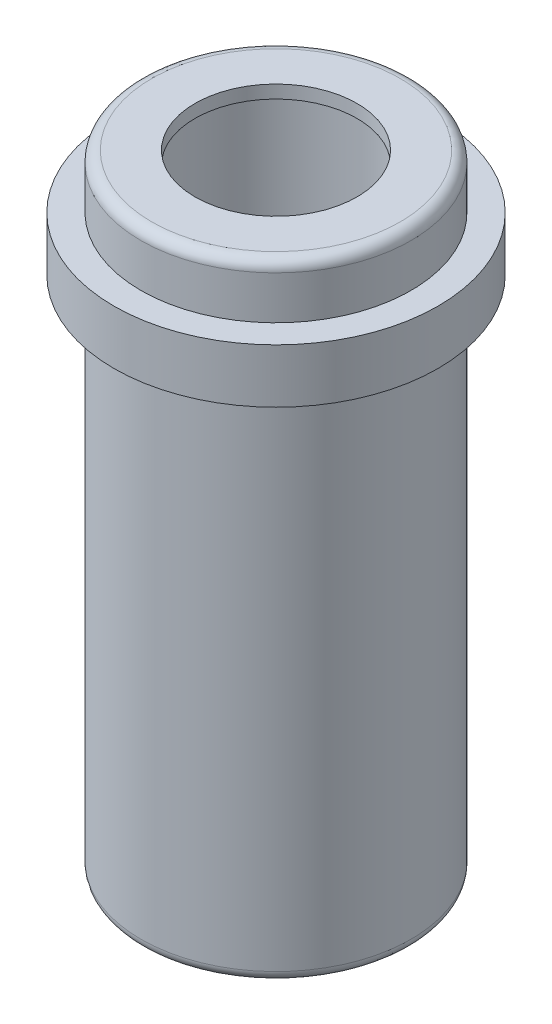
ISO-10303-21;
HEADER;
FILE_DESCRIPTION(('STEP AP214'),'2;1');
FILE_NAME('part.step','',(''),(''),'','','');
FILE_SCHEMA(('AUTOMOTIVE_DESIGN { 1 0 10303 214 1 1 1 1 }'));
ENDSEC;
DATA;
#1=APPLICATION_CONTEXT('core data for automotive mechanical design processes');
#2=APPLICATION_PROTOCOL_DEFINITION('international standard','automotive_design',2000,#1);
#3=PRODUCT_CONTEXT('',#1,'mechanical');
#4=PRODUCT('Part','Part','',(#3));
#5=PRODUCT_RELATED_PRODUCT_CATEGORY('part','',(#4));
#6=PRODUCT_DEFINITION_FORMATION('','',#4);
#7=PRODUCT_DEFINITION_CONTEXT('part definition',#1,'design');
#8=PRODUCT_DEFINITION('design','',#6,#7);
#9=PRODUCT_DEFINITION_SHAPE('','',#8);
#10=(LENGTH_UNIT() NAMED_UNIT(*) SI_UNIT(.MILLI.,.METRE.));
#11=(NAMED_UNIT(*) PLANE_ANGLE_UNIT() SI_UNIT($,.RADIAN.));
#12=(NAMED_UNIT(*) SI_UNIT($,.STERADIAN.) SOLID_ANGLE_UNIT());
#13=UNCERTAINTY_MEASURE_WITH_UNIT(LENGTH_MEASURE(1.E-05),#10,'distance_accuracy_value','');
#14=(GEOMETRIC_REPRESENTATION_CONTEXT(3) GLOBAL_UNCERTAINTY_ASSIGNED_CONTEXT((#13)) GLOBAL_UNIT_ASSIGNED_CONTEXT((#10,
#11,#12)) REPRESENTATION_CONTEXT('',''));
#15=CARTESIAN_POINT('',(0.,0.,0.));
#16=DIRECTION('',(0.,0.,1.));
#17=DIRECTION('',(1.,0.,0.));
#18=AXIS2_PLACEMENT_3D('',#15,#16,#17);
#19=CARTESIAN_POINT('',(0.,-4.20414276315988,0.));
#20=DIRECTION('',(0.,1.,0.));
#21=DIRECTION('',(0.,0.,1.));
#22=AXIS2_PLACEMENT_3D('',#19,#20,#21);
#23=CONICAL_SURFACE('',#22,0.,0.981268029555178);
#24=CARTESIAN_POINT('',(0.,-3.6,0.));
#25=DIRECTION('',(0.,1.,0.));
#26=DIRECTION('',(0.,0.,1.));
#27=AXIS2_PLACEMENT_3D('',#24,#25,#26);
#28=CIRCLE('',#27,0.903225337817097);
#29=CARTESIAN_POINT('',(0.,-3.6,0.903225337817097));
#30=VERTEX_POINT('',#29);
#31=EDGE_CURVE('E77',#30,#30,#28,.T.);
#32=ORIENTED_EDGE('',*,*,#31,.T.);
#33=EDGE_LOOP('',(#32));
#34=FACE_BOUND('',#33,.T.);
#35=CARTESIAN_POINT('',(0.,-4.20414276315988,0.));
#36=VERTEX_POINT('',#35);
#37=VERTEX_LOOP('',#36);
#38=FACE_BOUND('',#37,.T.);
#39=ADVANCED_FACE('F35',(#34,#38),#23,.F.);
#40=CARTESIAN_POINT('',(0.,8.23878905517164,0.));
#41=DIRECTION('',(0.,1.,0.));
#42=DIRECTION('',(0.,0.,1.));
#43=AXIS2_PLACEMENT_3D('',#40,#41,#42);
#44=CYLINDRICAL_SURFACE('',#43,0.903225337817098);
#45=CARTESIAN_POINT('',(0.,0.879741215099305,0.));
#46=DIRECTION('',(0.,1.,0.));
#47=DIRECTION('',(0.,0.,1.));
#48=AXIS2_PLACEMENT_3D('',#45,#46,#47);
#49=CIRCLE('',#48,0.903225337817098);
#50=CARTESIAN_POINT('',(0.,0.879741215099305,0.903225337817098));
#51=VERTEX_POINT('',#50);
#52=EDGE_CURVE('E80',#51,#51,#49,.T.);
#53=ORIENTED_EDGE('',*,*,#52,.T.);
#54=EDGE_LOOP('',(#53));
#55=FACE_BOUND('',#54,.T.);
#56=ORIENTED_EDGE('',*,*,#31,.F.);
#57=EDGE_LOOP('',(#56));
#58=FACE_BOUND('',#57,.T.);
#59=ADVANCED_FACE('F46',(#55,#58),#44,.F.);
#60=CARTESIAN_POINT('',(-0.75,0.879741215099305,0.));
#61=DIRECTION('',(0.,-1.,0.));
#62=DIRECTION('',(0.,0.,-1.));
#63=AXIS2_PLACEMENT_3D('',#60,#61,#62);
#64=PLANE('',#63);
#65=CARTESIAN_POINT('',(0.,0.879741215099305,0.));
#66=DIRECTION('',(0.,1.,0.));
#67=DIRECTION('',(0.,0.,1.));
#68=AXIS2_PLACEMENT_3D('',#65,#66,#67);
#69=CIRCLE('',#68,0.75);
#70=CARTESIAN_POINT('',(0.,0.879741215099305,0.75));
#71=VERTEX_POINT('',#70);
#72=EDGE_CURVE('E109',#71,#71,#69,.T.);
#73=ORIENTED_EDGE('',*,*,#72,.T.);
#74=EDGE_LOOP('',(#73));
#75=FACE_BOUND('',#74,.T.);
#76=ORIENTED_EDGE('',*,*,#52,.F.);
#77=EDGE_LOOP('',(#76));
#78=FACE_BOUND('',#77,.T.);
#79=ADVANCED_FACE('F52',(#75,#78),#64,.T.);
#80=CARTESIAN_POINT('',(0.,8.23878905517164,0.));
#81=DIRECTION('',(0.,1.,0.));
#82=DIRECTION('',(0.,0.,1.));
#83=AXIS2_PLACEMENT_3D('',#80,#81,#82);
#84=CYLINDRICAL_SURFACE('',#83,0.749999999999999);
#85=CARTESIAN_POINT('',(0.,0.999999999999999,0.));
#86=DIRECTION('',(0.,1.,0.));
#87=DIRECTION('',(0.,0.,1.));
#88=AXIS2_PLACEMENT_3D('',#85,#86,#87);
#89=CIRCLE('',#88,0.749999999999999);
#90=CARTESIAN_POINT('',(0.,0.999999999999999,0.749999999999999));
#91=VERTEX_POINT('',#90);
#92=EDGE_CURVE('E106',#91,#91,#89,.T.);
#93=ORIENTED_EDGE('',*,*,#92,.T.);
#94=EDGE_LOOP('',(#93));
#95=FACE_BOUND('',#94,.T.);
#96=ORIENTED_EDGE('',*,*,#72,.F.);
#97=EDGE_LOOP('',(#96));
#98=FACE_BOUND('',#97,.T.);
#99=ADVANCED_FACE('F116',(#95,#98),#84,.F.);
#100=CARTESIAN_POINT('',(-1.25,0.999999999999999,0.));
#101=DIRECTION('',(0.,1.,0.));
#102=DIRECTION('',(0.,0.,1.));
#103=AXIS2_PLACEMENT_3D('',#100,#101,#102);
#104=PLANE('',#103);
#105=CARTESIAN_POINT('',(0.,0.999999999999999,0.));
#106=DIRECTION('',(0.,1.,0.));
#107=DIRECTION('',(0.,0.,1.));
#108=AXIS2_PLACEMENT_3D('',#105,#106,#107);
#109=CIRCLE('',#108,1.15);
#110=CARTESIAN_POINT('',(0.,0.999999999999999,1.15));
#111=VERTEX_POINT('',#110);
#112=EDGE_CURVE('E75',#111,#111,#109,.T.);
#113=ORIENTED_EDGE('',*,*,#112,.T.);
#114=EDGE_LOOP('',(#113));
#115=FACE_BOUND('',#114,.T.);
#116=ORIENTED_EDGE('',*,*,#92,.F.);
#117=EDGE_LOOP('',(#116));
#118=FACE_BOUND('',#117,.T.);
#119=ADVANCED_FACE('F121',(#115,#118),#104,.T.);
#120=CARTESIAN_POINT('',(0.,8.23878905517164,0.));
#121=DIRECTION('',(0.,1.,0.));
#122=DIRECTION('',(0.,0.,1.));
#123=AXIS2_PLACEMENT_3D('',#120,#121,#122);
#124=CYLINDRICAL_SURFACE('',#123,1.25);
#125=CARTESIAN_POINT('',(0.,0.899999999999999,0.));
#126=DIRECTION('',(0.,1.,0.));
#127=DIRECTION('',(0.,0.,1.));
#128=AXIS2_PLACEMENT_3D('',#125,#126,#127);
#129=CIRCLE('',#128,1.25);
#130=CARTESIAN_POINT('',(0.,0.899999999999999,1.25));
#131=VERTEX_POINT('',#130);
#132=EDGE_CURVE('E72',#131,#131,#129,.F.);
#133=ORIENTED_EDGE('',*,*,#132,.T.);
#134=EDGE_LOOP('',(#133));
#135=FACE_BOUND('',#134,.T.);
#136=CARTESIAN_POINT('',(0.,0.499999999999999,0.));
#137=DIRECTION('',(0.,1.,0.));
#138=DIRECTION('',(0.,0.,1.));
#139=AXIS2_PLACEMENT_3D('',#136,#137,#138);
#140=CIRCLE('',#139,1.25);
#141=CARTESIAN_POINT('',(0.,0.499999999999999,1.25));
#142=VERTEX_POINT('',#141);
#143=EDGE_CURVE('E103',#142,#142,#140,.T.);
#144=ORIENTED_EDGE('',*,*,#143,.T.);
#145=EDGE_LOOP('',(#144));
#146=FACE_BOUND('',#145,.T.);
#147=ADVANCED_FACE('F127',(#135,#146),#124,.T.);
#148=CARTESIAN_POINT('',(-1.5,0.499999999999999,0.));
#149=DIRECTION('',(0.,1.,0.));
#150=DIRECTION('',(0.,0.,1.));
#151=AXIS2_PLACEMENT_3D('',#148,#149,#150);
#152=PLANE('',#151);
#153=CARTESIAN_POINT('',(0.,0.499999999999999,0.));
#154=DIRECTION('',(0.,1.,0.));
#155=DIRECTION('',(0.,0.,1.));
#156=AXIS2_PLACEMENT_3D('',#153,#154,#155);
#157=CIRCLE('',#156,1.5);
#158=CARTESIAN_POINT('',(0.,0.499999999999999,1.5));
#159=VERTEX_POINT('',#158);
#160=EDGE_CURVE('E98',#159,#159,#157,.T.);
#161=ORIENTED_EDGE('',*,*,#160,.T.);
#162=EDGE_LOOP('',(#161));
#163=FACE_BOUND('',#162,.T.);
#164=ORIENTED_EDGE('',*,*,#143,.F.);
#165=EDGE_LOOP('',(#164));
#166=FACE_BOUND('',#165,.T.);
#167=ADVANCED_FACE('F130',(#163,#166),#152,.T.);
#168=CARTESIAN_POINT('',(0.,8.23878905517164,0.));
#169=DIRECTION('',(0.,1.,0.));
#170=DIRECTION('',(0.,0.,1.));
#171=AXIS2_PLACEMENT_3D('',#168,#169,#170);
#172=CYLINDRICAL_SURFACE('',#171,1.5);
#173=CARTESIAN_POINT('',(0.,0.,0.));
#174=DIRECTION('',(0.,1.,0.));
#175=DIRECTION('',(0.,0.,1.));
#176=AXIS2_PLACEMENT_3D('',#173,#174,#175);
#177=CIRCLE('',#176,1.5);
#178=CARTESIAN_POINT('',(0.,0.,1.5));
#179=VERTEX_POINT('',#178);
#180=EDGE_CURVE('E95',#179,#179,#177,.T.);
#181=ORIENTED_EDGE('',*,*,#180,.T.);
#182=EDGE_LOOP('',(#181));
#183=FACE_BOUND('',#182,.T.);
#184=ORIENTED_EDGE('',*,*,#160,.F.);
#185=EDGE_LOOP('',(#184));
#186=FACE_BOUND('',#185,.T.);
#187=ADVANCED_FACE('F134',(#183,#186),#172,.T.);
#188=CARTESIAN_POINT('',(-1.25,0.,0.));
#189=DIRECTION('',(0.,-1.,0.));
#190=DIRECTION('',(0.,0.,-1.));
#191=AXIS2_PLACEMENT_3D('',#188,#189,#190);
#192=PLANE('',#191);
#193=CARTESIAN_POINT('',(0.,0.,0.));
#194=DIRECTION('',(0.,1.,0.));
#195=DIRECTION('',(0.,0.,1.));
#196=AXIS2_PLACEMENT_3D('',#193,#194,#195);
#197=CIRCLE('',#196,1.25);
#198=CARTESIAN_POINT('',(0.,0.,1.25));
#199=VERTEX_POINT('',#198);
#200=EDGE_CURVE('E93',#199,#199,#197,.T.);
#201=ORIENTED_EDGE('',*,*,#200,.T.);
#202=EDGE_LOOP('',(#201));
#203=FACE_BOUND('',#202,.T.);
#204=ORIENTED_EDGE('',*,*,#180,.F.);
#205=EDGE_LOOP('',(#204));
#206=FACE_BOUND('',#205,.T.);
#207=ADVANCED_FACE('F89',(#203,#206),#192,.T.);
#208=CARTESIAN_POINT('',(0.,8.23878905517164,0.));
#209=DIRECTION('',(0.,1.,0.));
#210=DIRECTION('',(0.,0.,1.));
#211=AXIS2_PLACEMENT_3D('',#208,#209,#210);
#212=CYLINDRICAL_SURFACE('',#211,1.25);
#213=CARTESIAN_POINT('',(0.,-4.7,0.));
#214=DIRECTION('',(0.,-1.,0.));
#215=DIRECTION('',(0.,0.,-1.));
#216=AXIS2_PLACEMENT_3D('',#213,#214,#215);
#217=CIRCLE('',#216,1.25);
#218=CARTESIAN_POINT('',(0.,-4.7,-1.25));
#219=VERTEX_POINT('',#218);
#220=EDGE_CURVE('E42',#219,#219,#217,.F.);
#221=ORIENTED_EDGE('',*,*,#220,.T.);
#222=EDGE_LOOP('',(#221));
#223=FACE_BOUND('',#222,.T.);
#224=ORIENTED_EDGE('',*,*,#200,.F.);
#225=EDGE_LOOP('',(#224));
#226=FACE_BOUND('',#225,.T.);
#227=ADVANCED_FACE('F66',(#223,#226),#212,.T.);
#228=CARTESIAN_POINT('',(0.,-4.8,0.));
#229=DIRECTION('',(0.,-1.,0.));
#230=DIRECTION('',(0.,0.,-1.));
#231=AXIS2_PLACEMENT_3D('',#228,#229,#230);
#232=PLANE('',#231);
#233=CARTESIAN_POINT('',(0.,-4.8,0.));
#234=DIRECTION('',(0.,-1.,0.));
#235=DIRECTION('',(0.,0.,-1.));
#236=AXIS2_PLACEMENT_3D('',#233,#234,#235);
#237=CIRCLE('',#236,1.15);
#238=CARTESIAN_POINT('',(0.,-4.8,-1.15));
#239=VERTEX_POINT('',#238);
#240=EDGE_CURVE('E11',#239,#239,#237,.T.);
#241=ORIENTED_EDGE('',*,*,#240,.T.);
#242=EDGE_LOOP('',(#241));
#243=FACE_BOUND('',#242,.T.);
#244=ADVANCED_FACE('F59',(#243),#232,.T.);
#245=CARTESIAN_POINT('',(0.,0.899999999999999,0.));
#246=DIRECTION('',(0.,1.,0.));
#247=DIRECTION('',(0.,0.,1.));
#248=AXIS2_PLACEMENT_3D('',#245,#246,#247);
#249=TOROIDAL_SURFACE('',#248,1.15,0.1);
#250=ORIENTED_EDGE('',*,*,#132,.F.);
#251=EDGE_LOOP('',(#250));
#252=FACE_BOUND('',#251,.T.);
#253=ORIENTED_EDGE('',*,*,#112,.F.);
#254=EDGE_LOOP('',(#253));
#255=FACE_BOUND('',#254,.T.);
#256=ADVANCED_FACE('F57',(#252,#255),#249,.T.);
#257=CARTESIAN_POINT('',(0.,-4.7,0.));
#258=DIRECTION('',(0.,-1.,0.));
#259=DIRECTION('',(0.,0.,-1.));
#260=AXIS2_PLACEMENT_3D('',#257,#258,#259);
#261=TOROIDAL_SURFACE('',#260,1.15,0.1);
#262=ORIENTED_EDGE('',*,*,#240,.F.);
#263=EDGE_LOOP('',(#262));
#264=FACE_BOUND('',#263,.T.);
#265=ORIENTED_EDGE('',*,*,#220,.F.);
#266=EDGE_LOOP('',(#265));
#267=FACE_BOUND('',#266,.T.);
#268=ADVANCED_FACE('F37',(#264,#267),#261,.T.);
#269=CLOSED_SHELL('',(#39,#59,#79,#99,#119,#147,#167,#187,#207,#227,#244,#256,#268));
#270=MANIFOLD_SOLID_BREP('B2',#269);
#271=ADVANCED_BREP_SHAPE_REPRESENTATION('',(#18,#270),#14);
#272=SHAPE_DEFINITION_REPRESENTATION(#9,#271);
ENDSEC;
END-ISO-10303-21;
